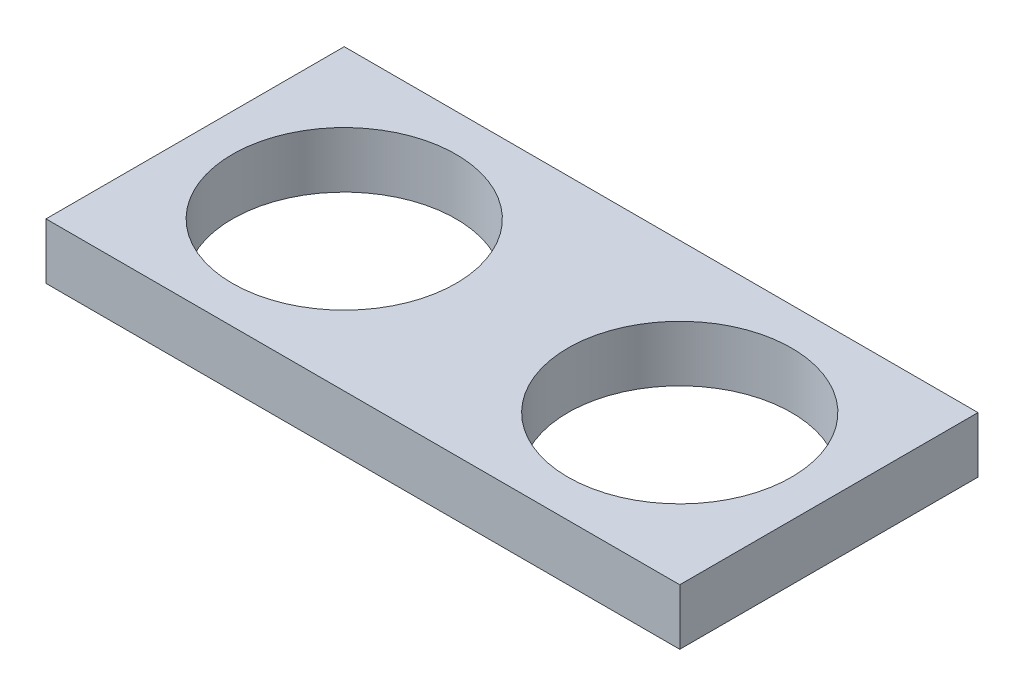
ISO-10303-21;
HEADER;
FILE_DESCRIPTION(('STEP AP214'),'2;1');
FILE_NAME('part.step','',(''),(''),'','','');
FILE_SCHEMA(('AUTOMOTIVE_DESIGN { 1 0 10303 214 1 1 1 1 }'));
ENDSEC;
DATA;
#1=APPLICATION_CONTEXT('core data for automotive mechanical design processes');
#2=APPLICATION_PROTOCOL_DEFINITION('international standard','automotive_design',2000,#1);
#3=PRODUCT_CONTEXT('',#1,'mechanical');
#4=PRODUCT('Part','Part','',(#3));
#5=PRODUCT_RELATED_PRODUCT_CATEGORY('part','',(#4));
#6=PRODUCT_DEFINITION_FORMATION('','',#4);
#7=PRODUCT_DEFINITION_CONTEXT('part definition',#1,'design');
#8=PRODUCT_DEFINITION('design','',#6,#7);
#9=PRODUCT_DEFINITION_SHAPE('','',#8);
#10=(LENGTH_UNIT() NAMED_UNIT(*) SI_UNIT(.MILLI.,.METRE.));
#11=(NAMED_UNIT(*) PLANE_ANGLE_UNIT() SI_UNIT($,.RADIAN.));
#12=(NAMED_UNIT(*) SI_UNIT($,.STERADIAN.) SOLID_ANGLE_UNIT());
#13=UNCERTAINTY_MEASURE_WITH_UNIT(LENGTH_MEASURE(1.E-05),#10,'distance_accuracy_value','');
#14=(GEOMETRIC_REPRESENTATION_CONTEXT(3) GLOBAL_UNCERTAINTY_ASSIGNED_CONTEXT((#13)) GLOBAL_UNIT_ASSIGNED_CONTEXT((#10,
#11,#12)) REPRESENTATION_CONTEXT('',''));
#15=CARTESIAN_POINT('',(0.,0.,0.));
#16=DIRECTION('',(0.,0.,1.));
#17=DIRECTION('',(1.,0.,0.));
#18=AXIS2_PLACEMENT_3D('',#15,#16,#17);
#19=CARTESIAN_POINT('',(0.,3.,0.));
#20=DIRECTION('',(0.,-1.,0.));
#21=DIRECTION('',(0.,0.,-1.));
#22=AXIS2_PLACEMENT_3D('',#19,#20,#21);
#23=PLANE('',#22);
#24=DIRECTION('',(0.,0.,1.));
#25=VECTOR('',#24,1.);
#26=CARTESIAN_POINT('',(0.,3.,0.));
#27=LINE('',#26,#25);
#28=CARTESIAN_POINT('',(0.,3.,-16.));
#29=VERTEX_POINT('',#28);
#30=CARTESIAN_POINT('',(0.,3.,0.));
#31=VERTEX_POINT('',#30);
#32=EDGE_CURVE('E96',#29,#31,#27,.T.);
#33=ORIENTED_EDGE('',*,*,#32,.T.);
#34=DIRECTION('',(1.,0.,0.));
#35=VECTOR('',#34,1.);
#36=CARTESIAN_POINT('',(0.,3.,0.));
#37=LINE('',#36,#35);
#38=CARTESIAN_POINT('',(34.,3.,0.));
#39=VERTEX_POINT('',#38);
#40=EDGE_CURVE('E91',#31,#39,#37,.T.);
#41=ORIENTED_EDGE('',*,*,#40,.T.);
#42=DIRECTION('',(0.,0.,-1.));
#43=VECTOR('',#42,1.);
#44=CARTESIAN_POINT('',(34.,3.,0.));
#45=LINE('',#44,#43);
#46=CARTESIAN_POINT('',(34.,3.,-16.));
#47=VERTEX_POINT('',#46);
#48=EDGE_CURVE('E94',#39,#47,#45,.T.);
#49=ORIENTED_EDGE('',*,*,#48,.T.);
#50=DIRECTION('',(-1.,0.,0.));
#51=VECTOR('',#50,1.);
#52=CARTESIAN_POINT('',(0.,3.,-16.));
#53=LINE('',#52,#51);
#54=EDGE_CURVE('E61',#47,#29,#53,.T.);
#55=ORIENTED_EDGE('',*,*,#54,.T.);
#56=EDGE_LOOP('',(#33,#41,#49,#55));
#57=FACE_BOUND('',#56,.T.);
#58=CARTESIAN_POINT('',(26.,3.,-8.));
#59=DIRECTION('',(0.,1.,0.));
#60=DIRECTION('',(0.,0.,1.));
#61=AXIS2_PLACEMENT_3D('',#58,#59,#60);
#62=CIRCLE('',#61,6.);
#63=CARTESIAN_POINT('',(26.,3.,-2.));
#64=VERTEX_POINT('',#63);
#65=EDGE_CURVE('E116',#64,#64,#62,.T.);
#66=ORIENTED_EDGE('',*,*,#65,.F.);
#67=EDGE_LOOP('',(#66));
#68=FACE_BOUND('',#67,.T.);
#69=CARTESIAN_POINT('',(8.00000000000001,3.,-8.));
#70=DIRECTION('',(0.,1.,0.));
#71=DIRECTION('',(0.,0.,1.));
#72=AXIS2_PLACEMENT_3D('',#69,#70,#71);
#73=CIRCLE('',#72,6.);
#74=CARTESIAN_POINT('',(8.00000000000001,3.,-2.));
#75=VERTEX_POINT('',#74);
#76=EDGE_CURVE('E138',#75,#75,#73,.T.);
#77=ORIENTED_EDGE('',*,*,#76,.F.);
#78=EDGE_LOOP('',(#77));
#79=FACE_BOUND('',#78,.T.);
#80=ADVANCED_FACE('F43',(#57,#68,#79),#23,.F.);
#81=CARTESIAN_POINT('',(0.,0.,0.));
#82=DIRECTION('',(0.,-1.,0.));
#83=DIRECTION('',(0.,0.,-1.));
#84=AXIS2_PLACEMENT_3D('',#81,#82,#83);
#85=PLANE('',#84);
#86=CARTESIAN_POINT('',(26.,0.,-8.));
#87=DIRECTION('',(0.,1.,0.));
#88=DIRECTION('',(0.,0.,1.));
#89=AXIS2_PLACEMENT_3D('',#86,#87,#88);
#90=CIRCLE('',#89,6.);
#91=CARTESIAN_POINT('',(26.,0.,-2.));
#92=VERTEX_POINT('',#91);
#93=EDGE_CURVE('E134',#92,#92,#90,.T.);
#94=ORIENTED_EDGE('',*,*,#93,.T.);
#95=EDGE_LOOP('',(#94));
#96=FACE_BOUND('',#95,.T.);
#97=DIRECTION('',(0.,0.,1.));
#98=VECTOR('',#97,1.);
#99=CARTESIAN_POINT('',(0.,0.,0.));
#100=LINE('',#99,#98);
#101=CARTESIAN_POINT('',(0.,0.,-16.));
#102=VERTEX_POINT('',#101);
#103=CARTESIAN_POINT('',(0.,0.,0.));
#104=VERTEX_POINT('',#103);
#105=EDGE_CURVE('E112',#102,#104,#100,.T.);
#106=ORIENTED_EDGE('',*,*,#105,.F.);
#107=DIRECTION('',(-1.,0.,0.));
#108=VECTOR('',#107,1.);
#109=CARTESIAN_POINT('',(0.,0.,-16.));
#110=LINE('',#109,#108);
#111=CARTESIAN_POINT('',(34.,0.,-16.));
#112=VERTEX_POINT('',#111);
#113=EDGE_CURVE('E84',#112,#102,#110,.T.);
#114=ORIENTED_EDGE('',*,*,#113,.F.);
#115=DIRECTION('',(0.,0.,-1.));
#116=VECTOR('',#115,1.);
#117=CARTESIAN_POINT('',(34.,0.,0.));
#118=LINE('',#117,#116);
#119=CARTESIAN_POINT('',(34.,0.,0.));
#120=VERTEX_POINT('',#119);
#121=EDGE_CURVE('E78',#120,#112,#118,.T.);
#122=ORIENTED_EDGE('',*,*,#121,.F.);
#123=DIRECTION('',(1.,0.,0.));
#124=VECTOR('',#123,1.);
#125=CARTESIAN_POINT('',(0.,0.,0.));
#126=LINE('',#125,#124);
#127=EDGE_CURVE('E101',#104,#120,#126,.T.);
#128=ORIENTED_EDGE('',*,*,#127,.F.);
#129=EDGE_LOOP('',(#106,#114,#122,#128));
#130=FACE_BOUND('',#129,.T.);
#131=CARTESIAN_POINT('',(8.00000000000001,0.,-8.));
#132=DIRECTION('',(0.,1.,0.));
#133=DIRECTION('',(0.,0.,1.));
#134=AXIS2_PLACEMENT_3D('',#131,#132,#133);
#135=CIRCLE('',#134,6.);
#136=CARTESIAN_POINT('',(8.00000000000001,0.,-2.));
#137=VERTEX_POINT('',#136);
#138=EDGE_CURVE('E142',#137,#137,#135,.T.);
#139=ORIENTED_EDGE('',*,*,#138,.T.);
#140=EDGE_LOOP('',(#139));
#141=FACE_BOUND('',#140,.T.);
#142=ADVANCED_FACE('F129',(#96,#130,#141),#85,.T.);
#143=CARTESIAN_POINT('',(0.,3.,0.));
#144=DIRECTION('',(1.,0.,0.));
#145=DIRECTION('',(0.,0.,-1.));
#146=AXIS2_PLACEMENT_3D('',#143,#144,#145);
#147=PLANE('',#146);
#148=ORIENTED_EDGE('',*,*,#105,.T.);
#149=DIRECTION('',(0.,-1.,0.));
#150=VECTOR('',#149,1.);
#151=CARTESIAN_POINT('',(0.,3.,0.));
#152=LINE('',#151,#150);
#153=EDGE_CURVE('E11',#31,#104,#152,.T.);
#154=ORIENTED_EDGE('',*,*,#153,.F.);
#155=ORIENTED_EDGE('',*,*,#32,.F.);
#156=DIRECTION('',(0.,-1.,0.));
#157=VECTOR('',#156,1.);
#158=CARTESIAN_POINT('',(0.,3.,-16.));
#159=LINE('',#158,#157);
#160=EDGE_CURVE('E108',#29,#102,#159,.T.);
#161=ORIENTED_EDGE('',*,*,#160,.T.);
#162=EDGE_LOOP('',(#148,#154,#155,#161));
#163=FACE_BOUND('',#162,.T.);
#164=ADVANCED_FACE('F45',(#163),#147,.F.);
#165=CARTESIAN_POINT('',(0.,3.,0.));
#166=DIRECTION('',(0.,0.,-1.));
#167=DIRECTION('',(-1.,0.,0.));
#168=AXIS2_PLACEMENT_3D('',#165,#166,#167);
#169=PLANE('',#168);
#170=ORIENTED_EDGE('',*,*,#127,.T.);
#171=DIRECTION('',(0.,-1.,0.));
#172=VECTOR('',#171,1.);
#173=CARTESIAN_POINT('',(34.,3.,0.));
#174=LINE('',#173,#172);
#175=EDGE_CURVE('E53',#39,#120,#174,.T.);
#176=ORIENTED_EDGE('',*,*,#175,.F.);
#177=ORIENTED_EDGE('',*,*,#40,.F.);
#178=ORIENTED_EDGE('',*,*,#153,.T.);
#179=EDGE_LOOP('',(#170,#176,#177,#178));
#180=FACE_BOUND('',#179,.T.);
#181=ADVANCED_FACE('F100',(#180),#169,.F.);
#182=CARTESIAN_POINT('',(34.,3.,0.));
#183=DIRECTION('',(-1.,0.,0.));
#184=DIRECTION('',(0.,0.,1.));
#185=AXIS2_PLACEMENT_3D('',#182,#183,#184);
#186=PLANE('',#185);
#187=ORIENTED_EDGE('',*,*,#121,.T.);
#188=DIRECTION('',(0.,-1.,0.));
#189=VECTOR('',#188,1.);
#190=CARTESIAN_POINT('',(34.,3.,-16.));
#191=LINE('',#190,#189);
#192=EDGE_CURVE('E103',#47,#112,#191,.T.);
#193=ORIENTED_EDGE('',*,*,#192,.F.);
#194=ORIENTED_EDGE('',*,*,#48,.F.);
#195=ORIENTED_EDGE('',*,*,#175,.T.);
#196=EDGE_LOOP('',(#187,#193,#194,#195));
#197=FACE_BOUND('',#196,.T.);
#198=ADVANCED_FACE('F104',(#197),#186,.F.);
#199=CARTESIAN_POINT('',(0.,3.,-16.));
#200=DIRECTION('',(0.,0.,1.));
#201=DIRECTION('',(1.,0.,0.));
#202=AXIS2_PLACEMENT_3D('',#199,#200,#201);
#203=PLANE('',#202);
#204=ORIENTED_EDGE('',*,*,#113,.T.);
#205=ORIENTED_EDGE('',*,*,#160,.F.);
#206=ORIENTED_EDGE('',*,*,#54,.F.);
#207=ORIENTED_EDGE('',*,*,#192,.T.);
#208=EDGE_LOOP('',(#204,#205,#206,#207));
#209=FACE_BOUND('',#208,.T.);
#210=ADVANCED_FACE('F126',(#209),#203,.F.);
#211=CARTESIAN_POINT('',(26.,3.,-8.));
#212=DIRECTION('',(0.,-1.,0.));
#213=DIRECTION('',(0.,0.,-1.));
#214=AXIS2_PLACEMENT_3D('',#211,#212,#213);
#215=CYLINDRICAL_SURFACE('',#214,6.);
#216=ORIENTED_EDGE('',*,*,#65,.T.);
#217=EDGE_LOOP('',(#216));
#218=FACE_BOUND('',#217,.T.);
#219=ORIENTED_EDGE('',*,*,#93,.F.);
#220=EDGE_LOOP('',(#219));
#221=FACE_BOUND('',#220,.T.);
#222=ADVANCED_FACE('F161',(#218,#221),#215,.F.);
#223=CARTESIAN_POINT('',(8.00000000000001,3.,-8.));
#224=DIRECTION('',(0.,-1.,0.));
#225=DIRECTION('',(0.,0.,-1.));
#226=AXIS2_PLACEMENT_3D('',#223,#224,#225);
#227=CYLINDRICAL_SURFACE('',#226,6.);
#228=ORIENTED_EDGE('',*,*,#76,.T.);
#229=EDGE_LOOP('',(#228));
#230=FACE_BOUND('',#229,.T.);
#231=ORIENTED_EDGE('',*,*,#138,.F.);
#232=EDGE_LOOP('',(#231));
#233=FACE_BOUND('',#232,.T.);
#234=ADVANCED_FACE('F150',(#230,#233),#227,.F.);
#235=CLOSED_SHELL('',(#80,#142,#164,#181,#198,#210,#222,#234));
#236=MANIFOLD_SOLID_BREP('B2',#235);
#237=ADVANCED_BREP_SHAPE_REPRESENTATION('',(#18,#236),#14);
#238=SHAPE_DEFINITION_REPRESENTATION(#9,#237);
ENDSEC;
END-ISO-10303-21;
